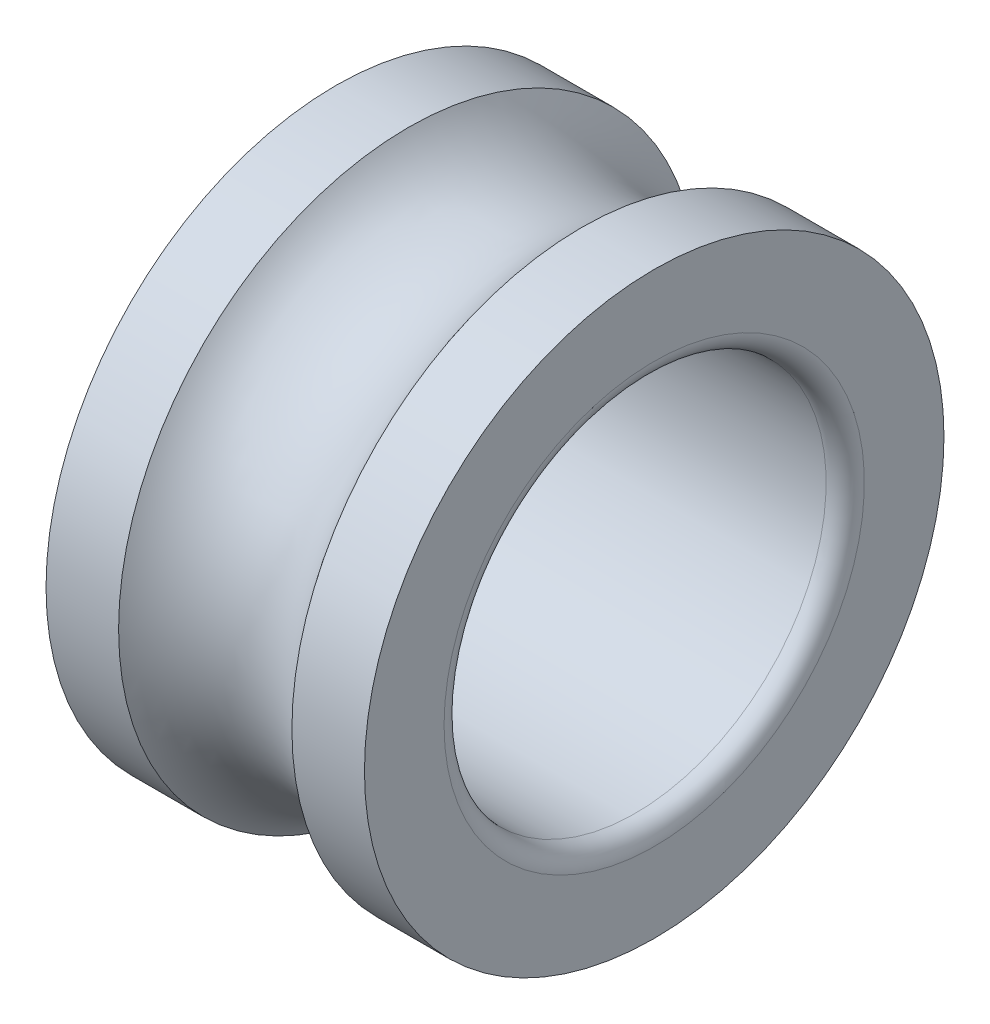
ISO-10303-21;
HEADER;
FILE_DESCRIPTION(('STEP AP214'),'2;1');
FILE_NAME('part.step','',(''),(''),'','','');
FILE_SCHEMA(('AUTOMOTIVE_DESIGN { 1 0 10303 214 1 1 1 1 }'));
ENDSEC;
DATA;
#1=APPLICATION_CONTEXT('core data for automotive mechanical design processes');
#2=APPLICATION_PROTOCOL_DEFINITION('international standard','automotive_design',2000,#1);
#3=PRODUCT_CONTEXT('',#1,'mechanical');
#4=PRODUCT('Part','Part','',(#3));
#5=PRODUCT_RELATED_PRODUCT_CATEGORY('part','',(#4));
#6=PRODUCT_DEFINITION_FORMATION('','',#4);
#7=PRODUCT_DEFINITION_CONTEXT('part definition',#1,'design');
#8=PRODUCT_DEFINITION('design','',#6,#7);
#9=PRODUCT_DEFINITION_SHAPE('','',#8);
#10=(LENGTH_UNIT() NAMED_UNIT(*) SI_UNIT(.MILLI.,.METRE.));
#11=(NAMED_UNIT(*) PLANE_ANGLE_UNIT() SI_UNIT($,.RADIAN.));
#12=(NAMED_UNIT(*) SI_UNIT($,.STERADIAN.) SOLID_ANGLE_UNIT());
#13=UNCERTAINTY_MEASURE_WITH_UNIT(LENGTH_MEASURE(1.E-05),#10,'distance_accuracy_value','');
#14=(GEOMETRIC_REPRESENTATION_CONTEXT(3) GLOBAL_UNCERTAINTY_ASSIGNED_CONTEXT((#13)) GLOBAL_UNIT_ASSIGNED_CONTEXT((#10,
#11,#12)) REPRESENTATION_CONTEXT('',''));
#15=CARTESIAN_POINT('',(0.,0.,0.));
#16=DIRECTION('',(0.,0.,1.));
#17=DIRECTION('',(1.,0.,0.));
#18=AXIS2_PLACEMENT_3D('',#15,#16,#17);
#19=CARTESIAN_POINT('',(0.,0.,0.));
#20=DIRECTION('',(-1.,0.,0.));
#21=DIRECTION('',(0.,0.,1.));
#22=AXIS2_PLACEMENT_3D('',#19,#20,#21);
#23=CYLINDRICAL_SURFACE('',#22,9.1);
#24=CARTESIAN_POINT('',(0.,0.,0.));
#25=DIRECTION('',(-1.,0.,0.));
#26=DIRECTION('',(0.,0.,1.));
#27=AXIS2_PLACEMENT_3D('',#24,#25,#26);
#28=CIRCLE('',#27,9.1);
#29=CARTESIAN_POINT('',(0.,0.,9.1));
#30=VERTEX_POINT('',#29);
#31=EDGE_CURVE('E10',#30,#30,#28,.T.);
#32=ORIENTED_EDGE('',*,*,#31,.F.);
#33=EDGE_LOOP('',(#32));
#34=FACE_BOUND('',#33,.T.);
#35=CARTESIAN_POINT('',(2.27869771779923,0.,0.));
#36=DIRECTION('',(-1.,0.,0.));
#37=DIRECTION('',(0.,0.,1.));
#38=AXIS2_PLACEMENT_3D('',#35,#36,#37);
#39=CIRCLE('',#38,9.1);
#40=CARTESIAN_POINT('',(2.27869771779923,0.,9.1));
#41=VERTEX_POINT('',#40);
#42=EDGE_CURVE('E58',#41,#41,#39,.T.);
#43=ORIENTED_EDGE('',*,*,#42,.T.);
#44=EDGE_LOOP('',(#43));
#45=FACE_BOUND('',#44,.T.);
#46=ADVANCED_FACE('F30',(#34,#45),#23,.T.);
#47=CARTESIAN_POINT('',(0.,9.1,0.));
#48=DIRECTION('',(1.,0.,0.));
#49=DIRECTION('',(0.,0.,-1.));
#50=AXIS2_PLACEMENT_3D('',#47,#48,#49);
#51=PLANE('',#50);
#52=CARTESIAN_POINT('',(0.,0.,0.));
#53=DIRECTION('',(-1.,0.,0.));
#54=DIRECTION('',(0.,0.,1.));
#55=AXIS2_PLACEMENT_3D('',#52,#53,#54);
#56=CIRCLE('',#55,6.6);
#57=CARTESIAN_POINT('',(0.,0.,6.6));
#58=VERTEX_POINT('',#57);
#59=EDGE_CURVE('E36',#58,#58,#56,.T.);
#60=ORIENTED_EDGE('',*,*,#59,.F.);
#61=EDGE_LOOP('',(#60));
#62=FACE_BOUND('',#61,.T.);
#63=ORIENTED_EDGE('',*,*,#31,.T.);
#64=EDGE_LOOP('',(#63));
#65=FACE_BOUND('',#64,.T.);
#66=ADVANCED_FACE('F75',(#62,#65),#51,.F.);
#67=CARTESIAN_POINT('',(0.600000000000003,0.,0.));
#68=DIRECTION('',(-1.,0.,0.));
#69=DIRECTION('',(0.,0.,1.));
#70=AXIS2_PLACEMENT_3D('',#67,#68,#69);
#71=TOROIDAL_SURFACE('',#70,6.6,0.6);
#72=CARTESIAN_POINT('',(0.600000000000003,0.,0.));
#73=DIRECTION('',(-1.,0.,0.));
#74=DIRECTION('',(0.,0.,1.));
#75=AXIS2_PLACEMENT_3D('',#72,#73,#74);
#76=CIRCLE('',#75,6.);
#77=CARTESIAN_POINT('',(0.600000000000003,0.,6.));
#78=VERTEX_POINT('',#77);
#79=EDGE_CURVE('E40',#78,#78,#76,.T.);
#80=ORIENTED_EDGE('',*,*,#79,.F.);
#81=EDGE_LOOP('',(#80));
#82=FACE_BOUND('',#81,.T.);
#83=ORIENTED_EDGE('',*,*,#59,.T.);
#84=EDGE_LOOP('',(#83));
#85=FACE_BOUND('',#84,.T.);
#86=ADVANCED_FACE('F80',(#82,#85),#71,.T.);
#87=CARTESIAN_POINT('',(0.,0.,0.));
#88=DIRECTION('',(-1.,0.,0.));
#89=DIRECTION('',(0.,0.,1.));
#90=AXIS2_PLACEMENT_3D('',#87,#88,#89);
#91=CYLINDRICAL_SURFACE('',#90,6.);
#92=CARTESIAN_POINT('',(9.40000000000001,0.,0.));
#93=DIRECTION('',(-1.,0.,0.));
#94=DIRECTION('',(0.,0.,1.));
#95=AXIS2_PLACEMENT_3D('',#92,#93,#94);
#96=CIRCLE('',#95,6.);
#97=CARTESIAN_POINT('',(9.40000000000001,0.,6.));
#98=VERTEX_POINT('',#97);
#99=EDGE_CURVE('E44',#98,#98,#96,.T.);
#100=ORIENTED_EDGE('',*,*,#99,.F.);
#101=EDGE_LOOP('',(#100));
#102=FACE_BOUND('',#101,.T.);
#103=ORIENTED_EDGE('',*,*,#79,.T.);
#104=EDGE_LOOP('',(#103));
#105=FACE_BOUND('',#104,.T.);
#106=ADVANCED_FACE('F85',(#102,#105),#91,.F.);
#107=CARTESIAN_POINT('',(9.40000000000001,0.,0.));
#108=DIRECTION('',(-1.,0.,0.));
#109=DIRECTION('',(0.,0.,1.));
#110=AXIS2_PLACEMENT_3D('',#107,#108,#109);
#111=TOROIDAL_SURFACE('',#110,6.6,0.6);
#112=CARTESIAN_POINT('',(9.99999999999999,0.,0.));
#113=DIRECTION('',(-1.,0.,0.));
#114=DIRECTION('',(0.,0.,1.));
#115=AXIS2_PLACEMENT_3D('',#112,#113,#114);
#116=CIRCLE('',#115,6.6);
#117=CARTESIAN_POINT('',(9.99999999999999,0.,6.6));
#118=VERTEX_POINT('',#117);
#119=EDGE_CURVE('E49',#118,#118,#116,.T.);
#120=ORIENTED_EDGE('',*,*,#119,.F.);
#121=EDGE_LOOP('',(#120));
#122=FACE_BOUND('',#121,.T.);
#123=ORIENTED_EDGE('',*,*,#99,.T.);
#124=EDGE_LOOP('',(#123));
#125=FACE_BOUND('',#124,.T.);
#126=ADVANCED_FACE('F91',(#122,#125),#111,.T.);
#127=CARTESIAN_POINT('',(9.99999999999999,6.60000000000001,0.));
#128=DIRECTION('',(-1.,0.,0.));
#129=DIRECTION('',(0.,0.,1.));
#130=AXIS2_PLACEMENT_3D('',#127,#128,#129);
#131=PLANE('',#130);
#132=CARTESIAN_POINT('',(9.99999999999999,0.,0.));
#133=DIRECTION('',(-1.,0.,0.));
#134=DIRECTION('',(0.,0.,1.));
#135=AXIS2_PLACEMENT_3D('',#132,#133,#134);
#136=CIRCLE('',#135,9.1);
#137=CARTESIAN_POINT('',(9.99999999999999,0.,9.1));
#138=VERTEX_POINT('',#137);
#139=EDGE_CURVE('E52',#138,#138,#136,.T.);
#140=ORIENTED_EDGE('',*,*,#139,.F.);
#141=EDGE_LOOP('',(#140));
#142=FACE_BOUND('',#141,.T.);
#143=ORIENTED_EDGE('',*,*,#119,.T.);
#144=EDGE_LOOP('',(#143));
#145=FACE_BOUND('',#144,.T.);
#146=ADVANCED_FACE('F71',(#142,#145),#131,.F.);
#147=CARTESIAN_POINT('',(0.,0.,0.));
#148=DIRECTION('',(-1.,0.,0.));
#149=DIRECTION('',(0.,0.,1.));
#150=AXIS2_PLACEMENT_3D('',#147,#148,#149);
#151=CYLINDRICAL_SURFACE('',#150,9.1);
#152=CARTESIAN_POINT('',(7.72130228220078,0.,0.));
#153=DIRECTION('',(-1.,0.,0.));
#154=DIRECTION('',(0.,0.,1.));
#155=AXIS2_PLACEMENT_3D('',#152,#153,#154);
#156=CIRCLE('',#155,9.1);
#157=CARTESIAN_POINT('',(7.72130228220078,0.,9.1));
#158=VERTEX_POINT('',#157);
#159=EDGE_CURVE('E55',#158,#158,#156,.T.);
#160=ORIENTED_EDGE('',*,*,#159,.F.);
#161=EDGE_LOOP('',(#160));
#162=FACE_BOUND('',#161,.T.);
#163=ORIENTED_EDGE('',*,*,#139,.T.);
#164=EDGE_LOOP('',(#163));
#165=FACE_BOUND('',#164,.T.);
#166=ADVANCED_FACE('F65',(#162,#165),#151,.T.);
#167=CARTESIAN_POINT('',(5.,0.,0.));
#168=DIRECTION('',(-1.,0.,0.));
#169=DIRECTION('',(0.,0.,1.));
#170=AXIS2_PLACEMENT_3D('',#167,#168,#169);
#171=TOROIDAL_SURFACE('',#170,11.025,3.33333333333333);
#172=ORIENTED_EDGE('',*,*,#159,.T.);
#173=EDGE_LOOP('',(#172));
#174=FACE_BOUND('',#173,.T.);
#175=ORIENTED_EDGE('',*,*,#42,.F.);
#176=EDGE_LOOP('',(#175));
#177=FACE_BOUND('',#176,.T.);
#178=ADVANCED_FACE('F63',(#174,#177),#171,.F.);
#179=CLOSED_SHELL('',(#46,#66,#86,#106,#126,#146,#166,#178));
#180=MANIFOLD_SOLID_BREP('B2',#179);
#181=ADVANCED_BREP_SHAPE_REPRESENTATION('',(#18,#180),#14);
#182=SHAPE_DEFINITION_REPRESENTATION(#9,#181);
ENDSEC;
END-ISO-10303-21;
